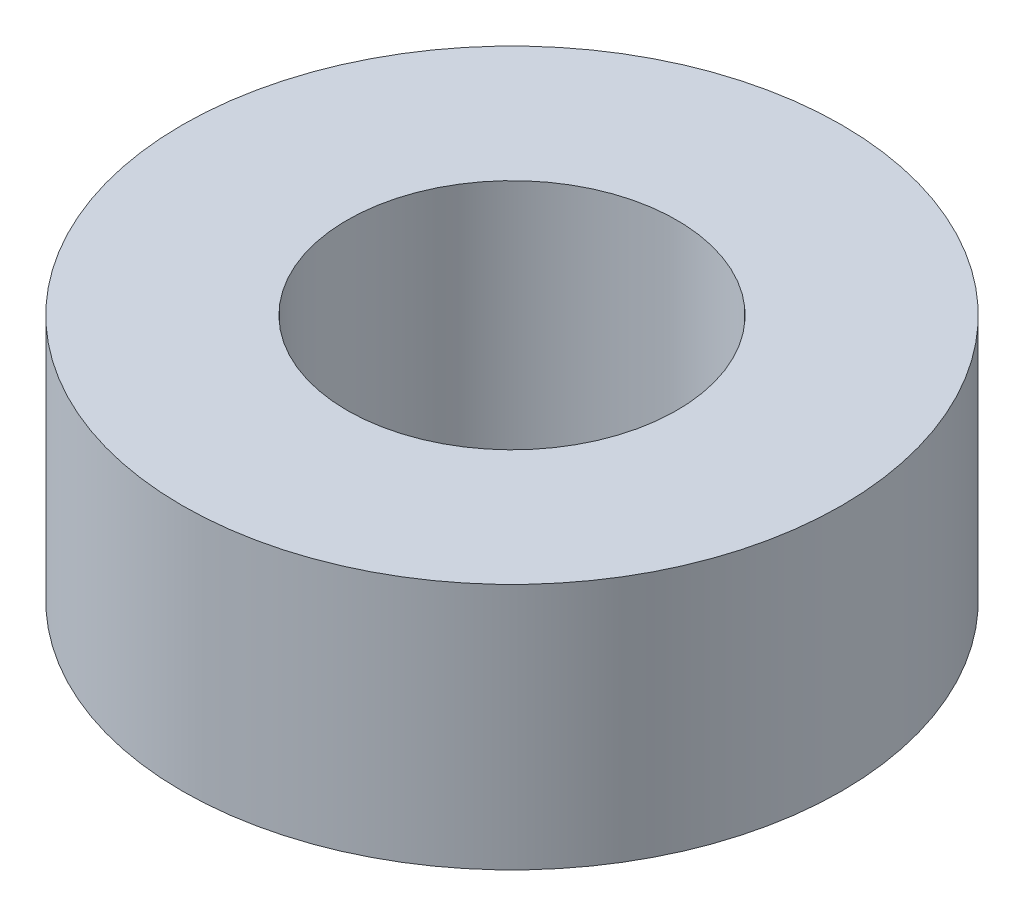
ISO-10303-21;
HEADER;
FILE_DESCRIPTION(('STEP AP214'),'2;1');
FILE_NAME('part.step','',(''),(''),'','','');
FILE_SCHEMA(('AUTOMOTIVE_DESIGN { 1 0 10303 214 1 1 1 1 }'));
ENDSEC;
DATA;
#1=APPLICATION_CONTEXT('core data for automotive mechanical design processes');
#2=APPLICATION_PROTOCOL_DEFINITION('international standard','automotive_design',2000,#1);
#3=PRODUCT_CONTEXT('',#1,'mechanical');
#4=PRODUCT('Part','Part','',(#3));
#5=PRODUCT_RELATED_PRODUCT_CATEGORY('part','',(#4));
#6=PRODUCT_DEFINITION_FORMATION('','',#4);
#7=PRODUCT_DEFINITION_CONTEXT('part definition',#1,'design');
#8=PRODUCT_DEFINITION('design','',#6,#7);
#9=PRODUCT_DEFINITION_SHAPE('','',#8);
#10=(LENGTH_UNIT() NAMED_UNIT(*) SI_UNIT(.MILLI.,.METRE.));
#11=(NAMED_UNIT(*) PLANE_ANGLE_UNIT() SI_UNIT($,.RADIAN.));
#12=(NAMED_UNIT(*) SI_UNIT($,.STERADIAN.) SOLID_ANGLE_UNIT());
#13=UNCERTAINTY_MEASURE_WITH_UNIT(LENGTH_MEASURE(1.E-05),#10,'distance_accuracy_value','');
#14=(GEOMETRIC_REPRESENTATION_CONTEXT(3) GLOBAL_UNCERTAINTY_ASSIGNED_CONTEXT((#13)) GLOBAL_UNIT_ASSIGNED_CONTEXT((#10,
#11,#12)) REPRESENTATION_CONTEXT('',''));
#15=CARTESIAN_POINT('',(0.,0.,0.));
#16=DIRECTION('',(0.,0.,1.));
#17=DIRECTION('',(1.,0.,0.));
#18=AXIS2_PLACEMENT_3D('',#15,#16,#17);
#19=CARTESIAN_POINT('',(0.,3.,0.));
#20=DIRECTION('',(0.,1.,0.));
#21=DIRECTION('',(0.,0.,1.));
#22=AXIS2_PLACEMENT_3D('',#19,#20,#21);
#23=PLANE('',#22);
#24=CARTESIAN_POINT('',(0.,3.,0.));
#25=DIRECTION('',(0.,1.,0.));
#26=DIRECTION('',(0.,0.,1.));
#27=AXIS2_PLACEMENT_3D('',#24,#25,#26);
#28=CIRCLE('',#27,4.);
#29=CARTESIAN_POINT('',(0.,3.,4.));
#30=VERTEX_POINT('',#29);
#31=EDGE_CURVE('E10',#30,#30,#28,.T.);
#32=ORIENTED_EDGE('',*,*,#31,.T.);
#33=EDGE_LOOP('',(#32));
#34=FACE_BOUND('',#33,.T.);
#35=CARTESIAN_POINT('',(0.,3.,0.));
#36=DIRECTION('',(0.,1.,0.));
#37=DIRECTION('',(0.,0.,1.));
#38=AXIS2_PLACEMENT_3D('',#35,#36,#37);
#39=CIRCLE('',#38,2.);
#40=CARTESIAN_POINT('',(0.,3.,2.));
#41=VERTEX_POINT('',#40);
#42=EDGE_CURVE('E50',#41,#41,#39,.T.);
#43=ORIENTED_EDGE('',*,*,#42,.F.);
#44=EDGE_LOOP('',(#43));
#45=FACE_BOUND('',#44,.T.);
#46=ADVANCED_FACE('F39',(#34,#45),#23,.T.);
#47=CARTESIAN_POINT('',(0.,0.,0.));
#48=DIRECTION('',(0.,1.,0.));
#49=DIRECTION('',(0.,0.,1.));
#50=AXIS2_PLACEMENT_3D('',#47,#48,#49);
#51=PLANE('',#50);
#52=CARTESIAN_POINT('',(0.,0.,0.));
#53=DIRECTION('',(0.,1.,0.));
#54=DIRECTION('',(0.,0.,1.));
#55=AXIS2_PLACEMENT_3D('',#52,#53,#54);
#56=CIRCLE('',#55,4.);
#57=CARTESIAN_POINT('',(0.,0.,4.));
#58=VERTEX_POINT('',#57);
#59=EDGE_CURVE('E43',#58,#58,#56,.T.);
#60=ORIENTED_EDGE('',*,*,#59,.F.);
#61=EDGE_LOOP('',(#60));
#62=FACE_BOUND('',#61,.T.);
#63=CARTESIAN_POINT('',(0.,0.,0.));
#64=DIRECTION('',(0.,1.,0.));
#65=DIRECTION('',(0.,0.,1.));
#66=AXIS2_PLACEMENT_3D('',#63,#64,#65);
#67=CIRCLE('',#66,2.);
#68=CARTESIAN_POINT('',(0.,0.,2.));
#69=VERTEX_POINT('',#68);
#70=EDGE_CURVE('E52',#69,#69,#67,.T.);
#71=ORIENTED_EDGE('',*,*,#70,.T.);
#72=EDGE_LOOP('',(#71));
#73=FACE_BOUND('',#72,.T.);
#74=ADVANCED_FACE('F62',(#62,#73),#51,.F.);
#75=CARTESIAN_POINT('',(0.,3.,0.));
#76=DIRECTION('',(0.,-1.,0.));
#77=DIRECTION('',(0.,0.,-1.));
#78=AXIS2_PLACEMENT_3D('',#75,#76,#77);
#79=CYLINDRICAL_SURFACE('',#78,4.);
#80=ORIENTED_EDGE('',*,*,#31,.F.);
#81=EDGE_LOOP('',(#80));
#82=FACE_BOUND('',#81,.T.);
#83=ORIENTED_EDGE('',*,*,#59,.T.);
#84=EDGE_LOOP('',(#83));
#85=FACE_BOUND('',#84,.T.);
#86=ADVANCED_FACE('F41',(#82,#85),#79,.T.);
#87=CARTESIAN_POINT('',(0.,3.,0.));
#88=DIRECTION('',(0.,-1.,0.));
#89=DIRECTION('',(0.,0.,-1.));
#90=AXIS2_PLACEMENT_3D('',#87,#88,#89);
#91=CYLINDRICAL_SURFACE('',#90,2.);
#92=ORIENTED_EDGE('',*,*,#42,.T.);
#93=EDGE_LOOP('',(#92));
#94=FACE_BOUND('',#93,.T.);
#95=ORIENTED_EDGE('',*,*,#70,.F.);
#96=EDGE_LOOP('',(#95));
#97=FACE_BOUND('',#96,.T.);
#98=ADVANCED_FACE('F58',(#94,#97),#91,.F.);
#99=CLOSED_SHELL('',(#46,#74,#86,#98));
#100=MANIFOLD_SOLID_BREP('B2',#99);
#101=ADVANCED_BREP_SHAPE_REPRESENTATION('',(#18,#100),#14);
#102=SHAPE_DEFINITION_REPRESENTATION(#9,#101);
ENDSEC;
END-ISO-10303-21;
